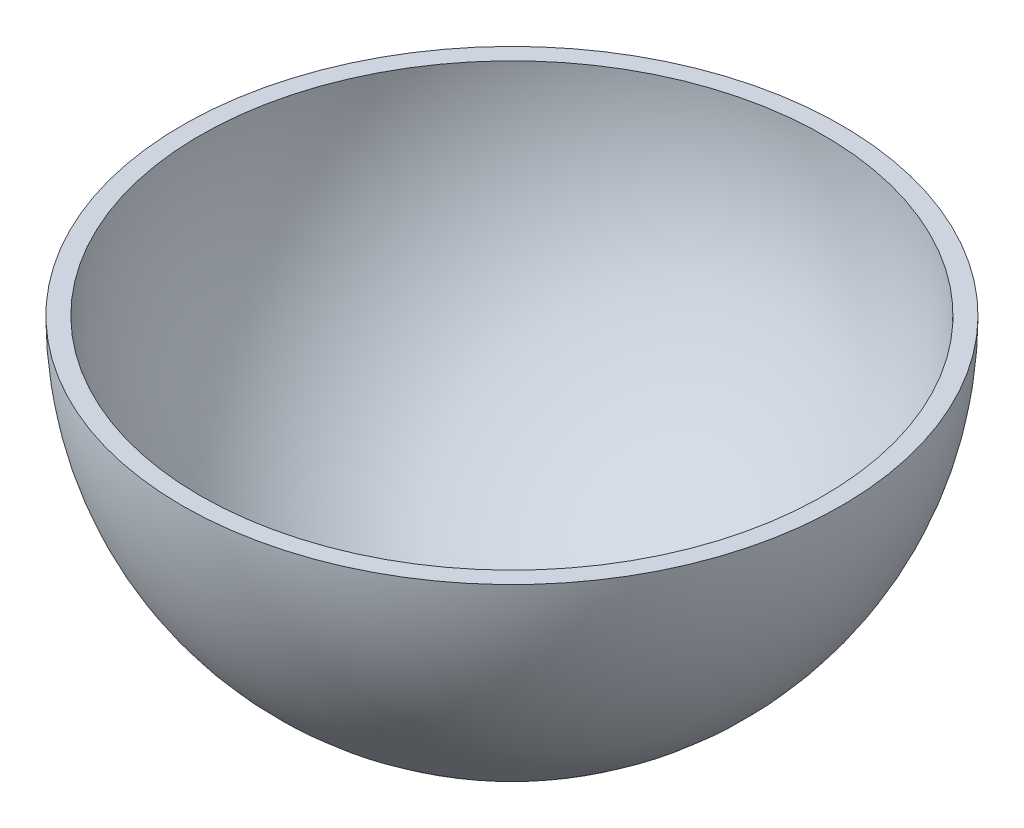
ISO-10303-21;
HEADER;
FILE_DESCRIPTION(('STEP AP214'),'2;1');
FILE_NAME('part.step','',(''),(''),'','','');
FILE_SCHEMA(('AUTOMOTIVE_DESIGN { 1 0 10303 214 1 1 1 1 }'));
ENDSEC;
DATA;
#1=APPLICATION_CONTEXT('core data for automotive mechanical design processes');
#2=APPLICATION_PROTOCOL_DEFINITION('international standard','automotive_design',2000,#1);
#3=PRODUCT_CONTEXT('',#1,'mechanical');
#4=PRODUCT('Part','Part','',(#3));
#5=PRODUCT_RELATED_PRODUCT_CATEGORY('part','',(#4));
#6=PRODUCT_DEFINITION_FORMATION('','',#4);
#7=PRODUCT_DEFINITION_CONTEXT('part definition',#1,'design');
#8=PRODUCT_DEFINITION('design','',#6,#7);
#9=PRODUCT_DEFINITION_SHAPE('','',#8);
#10=(LENGTH_UNIT() NAMED_UNIT(*) SI_UNIT(.MILLI.,.METRE.));
#11=(NAMED_UNIT(*) PLANE_ANGLE_UNIT() SI_UNIT($,.RADIAN.));
#12=(NAMED_UNIT(*) SI_UNIT($,.STERADIAN.) SOLID_ANGLE_UNIT());
#13=UNCERTAINTY_MEASURE_WITH_UNIT(LENGTH_MEASURE(1.E-05),#10,'distance_accuracy_value','');
#14=(GEOMETRIC_REPRESENTATION_CONTEXT(3) GLOBAL_UNCERTAINTY_ASSIGNED_CONTEXT((#13)) GLOBAL_UNIT_ASSIGNED_CONTEXT((#10,
#11,#12)) REPRESENTATION_CONTEXT('',''));
#15=CARTESIAN_POINT('',(0.,0.,0.));
#16=DIRECTION('',(0.,0.,1.));
#17=DIRECTION('',(1.,0.,0.));
#18=AXIS2_PLACEMENT_3D('',#15,#16,#17);
#19=CARTESIAN_POINT('',(0.,0.,0.));
#20=DIRECTION('',(0.,1.,0.));
#21=DIRECTION('',(0.,0.,1.));
#22=AXIS2_PLACEMENT_3D('',#19,#20,#21);
#23=SPHERICAL_SURFACE('',#22,28.);
#24=CARTESIAN_POINT('',(0.,0.,0.));
#25=DIRECTION('',(0.,1.,0.));
#26=DIRECTION('',(0.,0.,1.));
#27=AXIS2_PLACEMENT_3D('',#24,#25,#26);
#28=CIRCLE('',#27,28.);
#29=CARTESIAN_POINT('',(0.,0.,28.));
#30=VERTEX_POINT('',#29);
#31=EDGE_CURVE('E41',#30,#30,#28,.F.);
#32=ORIENTED_EDGE('',*,*,#31,.T.);
#33=EDGE_LOOP('',(#32));
#34=FACE_BOUND('',#33,.T.);
#35=ADVANCED_FACE('F38',(#34),#23,.T.);
#36=CARTESIAN_POINT('',(0.,0.,0.));
#37=DIRECTION('',(0.,1.,0.));
#38=DIRECTION('',(0.,0.,1.));
#39=AXIS2_PLACEMENT_3D('',#36,#37,#38);
#40=PLANE('',#39);
#41=ORIENTED_EDGE('',*,*,#31,.F.);
#42=EDGE_LOOP('',(#41));
#43=FACE_BOUND('',#42,.T.);
#44=CARTESIAN_POINT('',(0.,0.,0.));
#45=DIRECTION('',(0.,1.,0.));
#46=DIRECTION('',(0.,0.,1.));
#47=AXIS2_PLACEMENT_3D('',#44,#45,#46);
#48=CIRCLE('',#47,26.5);
#49=CARTESIAN_POINT('',(0.,0.,26.5));
#50=VERTEX_POINT('',#49);
#51=EDGE_CURVE('E10',#50,#50,#48,.F.);
#52=ORIENTED_EDGE('',*,*,#51,.T.);
#53=EDGE_LOOP('',(#52));
#54=FACE_BOUND('',#53,.T.);
#55=ADVANCED_FACE('F51',(#43,#54),#40,.T.);
#56=CARTESIAN_POINT('',(0.,0.,0.));
#57=DIRECTION('',(0.,1.,0.));
#58=DIRECTION('',(0.,0.,1.));
#59=AXIS2_PLACEMENT_3D('',#56,#57,#58);
#60=SPHERICAL_SURFACE('',#59,26.5);
#61=ORIENTED_EDGE('',*,*,#51,.F.);
#62=EDGE_LOOP('',(#61));
#63=FACE_BOUND('',#62,.T.);
#64=ADVANCED_FACE('F53',(#63),#60,.F.);
#65=CLOSED_SHELL('',(#35,#55,#64));
#66=MANIFOLD_SOLID_BREP('B2',#65);
#67=ADVANCED_BREP_SHAPE_REPRESENTATION('',(#18,#66),#14);
#68=SHAPE_DEFINITION_REPRESENTATION(#9,#67);
ENDSEC;
END-ISO-10303-21;
